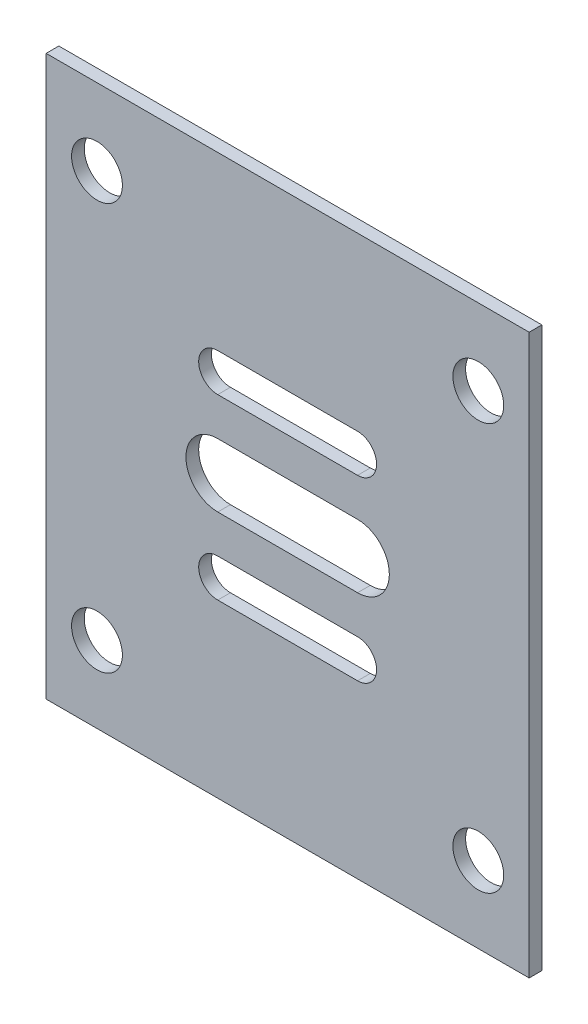
ISO-10303-21;
HEADER;
FILE_DESCRIPTION(('STEP AP214'),'2;1');
FILE_NAME('part.step','',(''),(''),'','','');
FILE_SCHEMA(('AUTOMOTIVE_DESIGN { 1 0 10303 214 1 1 1 1 }'));
ENDSEC;
DATA;
#1=APPLICATION_CONTEXT('core data for automotive mechanical design processes');
#2=APPLICATION_PROTOCOL_DEFINITION('international standard','automotive_design',2000,#1);
#3=PRODUCT_CONTEXT('',#1,'mechanical');
#4=PRODUCT('Part','Part','',(#3));
#5=PRODUCT_RELATED_PRODUCT_CATEGORY('part','',(#4));
#6=PRODUCT_DEFINITION_FORMATION('','',#4);
#7=PRODUCT_DEFINITION_CONTEXT('part definition',#1,'design');
#8=PRODUCT_DEFINITION('design','',#6,#7);
#9=PRODUCT_DEFINITION_SHAPE('','',#8);
#10=(LENGTH_UNIT() NAMED_UNIT(*) SI_UNIT(.MILLI.,.METRE.));
#11=(NAMED_UNIT(*) PLANE_ANGLE_UNIT() SI_UNIT($,.RADIAN.));
#12=(NAMED_UNIT(*) SI_UNIT($,.STERADIAN.) SOLID_ANGLE_UNIT());
#13=UNCERTAINTY_MEASURE_WITH_UNIT(LENGTH_MEASURE(1.E-05),#10,'distance_accuracy_value','');
#14=(GEOMETRIC_REPRESENTATION_CONTEXT(3) GLOBAL_UNCERTAINTY_ASSIGNED_CONTEXT((#13)) GLOBAL_UNIT_ASSIGNED_CONTEXT((#10,
#11,#12)) REPRESENTATION_CONTEXT('',''));
#15=CARTESIAN_POINT('',(0.,0.,0.));
#16=DIRECTION('',(0.,0.,1.));
#17=DIRECTION('',(1.,0.,0.));
#18=AXIS2_PLACEMENT_3D('',#15,#16,#17);
#19=CARTESIAN_POINT('',(0.,0.,1.));
#20=DIRECTION('',(0.,0.,-1.));
#21=DIRECTION('',(-1.,0.,0.));
#22=AXIS2_PLACEMENT_3D('',#19,#20,#21);
#23=PLANE('',#22);
#24=CARTESIAN_POINT('',(13.5,29.,1.));
#25=DIRECTION('',(0.,0.,1.));
#26=DIRECTION('',(1.,0.,0.));
#27=AXIS2_PLACEMENT_3D('',#24,#25,#26);
#28=CIRCLE('',#27,1.5);
#29=CARTESIAN_POINT('',(13.5,30.5,1.));
#30=VERTEX_POINT('',#29);
#31=CARTESIAN_POINT('',(13.5,27.5,1.));
#32=VERTEX_POINT('',#31);
#33=EDGE_CURVE('E201',#30,#32,#28,.T.);
#34=ORIENTED_EDGE('',*,*,#33,.F.);
#35=DIRECTION('',(-1.,0.,0.));
#36=VECTOR('',#35,1.);
#37=CARTESIAN_POINT('',(13.5,30.5,1.));
#38=LINE('',#37,#36);
#39=CARTESIAN_POINT('',(24.5,30.5,1.));
#40=VERTEX_POINT('',#39);
#41=EDGE_CURVE('E212',#40,#30,#38,.T.);
#42=ORIENTED_EDGE('',*,*,#41,.F.);
#43=CARTESIAN_POINT('',(24.5,29.,1.));
#44=DIRECTION('',(0.,0.,1.));
#45=DIRECTION('',(1.,0.,0.));
#46=AXIS2_PLACEMENT_3D('',#43,#44,#45);
#47=CIRCLE('',#46,1.5);
#48=CARTESIAN_POINT('',(24.5,27.5,1.));
#49=VERTEX_POINT('',#48);
#50=EDGE_CURVE('E208',#49,#40,#47,.T.);
#51=ORIENTED_EDGE('',*,*,#50,.F.);
#52=DIRECTION('',(1.,0.,0.));
#53=VECTOR('',#52,1.);
#54=CARTESIAN_POINT('',(13.5,27.5,1.));
#55=LINE('',#54,#53);
#56=EDGE_CURVE('E204',#32,#49,#55,.T.);
#57=ORIENTED_EDGE('',*,*,#56,.F.);
#58=EDGE_LOOP('',(#34,#42,#51,#57));
#59=FACE_BOUND('',#58,.T.);
#60=CARTESIAN_POINT('',(4.,6.,1.));
#61=DIRECTION('',(0.,0.,1.));
#62=DIRECTION('',(1.,0.,0.));
#63=AXIS2_PLACEMENT_3D('',#60,#61,#62);
#64=CIRCLE('',#63,2.);
#65=CARTESIAN_POINT('',(6.,6.,1.));
#66=VERTEX_POINT('',#65);
#67=EDGE_CURVE('E287',#66,#66,#64,.T.);
#68=ORIENTED_EDGE('',*,*,#67,.F.);
#69=EDGE_LOOP('',(#68));
#70=FACE_BOUND('',#69,.T.);
#71=CARTESIAN_POINT('',(34.,6.,1.));
#72=DIRECTION('',(0.,0.,1.));
#73=DIRECTION('',(1.,0.,0.));
#74=AXIS2_PLACEMENT_3D('',#71,#72,#73);
#75=CIRCLE('',#74,2.);
#76=CARTESIAN_POINT('',(36.,6.,1.));
#77=VERTEX_POINT('',#76);
#78=EDGE_CURVE('E295',#77,#77,#75,.T.);
#79=ORIENTED_EDGE('',*,*,#78,.F.);
#80=EDGE_LOOP('',(#79));
#81=FACE_BOUND('',#80,.T.);
#82=CARTESIAN_POINT('',(34.,38.,1.));
#83=DIRECTION('',(0.,0.,1.));
#84=DIRECTION('',(1.,0.,0.));
#85=AXIS2_PLACEMENT_3D('',#82,#83,#84);
#86=CIRCLE('',#85,2.);
#87=CARTESIAN_POINT('',(36.,38.,1.));
#88=VERTEX_POINT('',#87);
#89=EDGE_CURVE('E303',#88,#88,#86,.T.);
#90=ORIENTED_EDGE('',*,*,#89,.F.);
#91=EDGE_LOOP('',(#90));
#92=FACE_BOUND('',#91,.T.);
#93=CARTESIAN_POINT('',(4.,38.,1.));
#94=DIRECTION('',(0.,0.,1.));
#95=DIRECTION('',(1.,0.,0.));
#96=AXIS2_PLACEMENT_3D('',#93,#94,#95);
#97=CIRCLE('',#96,2.);
#98=CARTESIAN_POINT('',(6.,38.,1.));
#99=VERTEX_POINT('',#98);
#100=EDGE_CURVE('E311',#99,#99,#97,.T.);
#101=ORIENTED_EDGE('',*,*,#100,.F.);
#102=EDGE_LOOP('',(#101));
#103=FACE_BOUND('',#102,.T.);
#104=DIRECTION('',(0.,-1.,0.));
#105=VECTOR('',#104,1.);
#106=CARTESIAN_POINT('',(0.,0.,1.));
#107=LINE('',#106,#105);
#108=CARTESIAN_POINT('',(0.,44.,1.));
#109=VERTEX_POINT('',#108);
#110=CARTESIAN_POINT('',(0.,0.,1.));
#111=VERTEX_POINT('',#110);
#112=EDGE_CURVE('E319',#109,#111,#107,.T.);
#113=ORIENTED_EDGE('',*,*,#112,.T.);
#114=DIRECTION('',(1.,0.,0.));
#115=VECTOR('',#114,1.);
#116=CARTESIAN_POINT('',(0.,0.,1.));
#117=LINE('',#116,#115);
#118=CARTESIAN_POINT('',(38.,0.,1.));
#119=VERTEX_POINT('',#118);
#120=EDGE_CURVE('E323',#111,#119,#117,.T.);
#121=ORIENTED_EDGE('',*,*,#120,.T.);
#122=DIRECTION('',(0.,1.,0.));
#123=VECTOR('',#122,1.);
#124=CARTESIAN_POINT('',(38.,0.,1.));
#125=LINE('',#124,#123);
#126=CARTESIAN_POINT('',(38.,44.,1.));
#127=VERTEX_POINT('',#126);
#128=EDGE_CURVE('E327',#119,#127,#125,.T.);
#129=ORIENTED_EDGE('',*,*,#128,.T.);
#130=DIRECTION('',(-1.,0.,0.));
#131=VECTOR('',#130,1.);
#132=CARTESIAN_POINT('',(0.,44.,1.));
#133=LINE('',#132,#131);
#134=EDGE_CURVE('E330',#127,#109,#133,.T.);
#135=ORIENTED_EDGE('',*,*,#134,.T.);
#136=EDGE_LOOP('',(#113,#121,#129,#135));
#137=FACE_BOUND('',#136,.T.);
#138=CARTESIAN_POINT('',(13.5,22.,1.));
#139=DIRECTION('',(0.,0.,1.));
#140=DIRECTION('',(1.,0.,0.));
#141=AXIS2_PLACEMENT_3D('',#138,#139,#140);
#142=CIRCLE('',#141,2.5);
#143=CARTESIAN_POINT('',(13.5,24.5,1.));
#144=VERTEX_POINT('',#143);
#145=CARTESIAN_POINT('',(13.5,19.5,1.));
#146=VERTEX_POINT('',#145);
#147=EDGE_CURVE('E244',#144,#146,#142,.T.);
#148=ORIENTED_EDGE('',*,*,#147,.F.);
#149=DIRECTION('',(-1.,0.,0.));
#150=VECTOR('',#149,1.);
#151=CARTESIAN_POINT('',(13.5,24.5,1.));
#152=LINE('',#151,#150);
#153=CARTESIAN_POINT('',(24.5,24.5,1.));
#154=VERTEX_POINT('',#153);
#155=EDGE_CURVE('E255',#154,#144,#152,.T.);
#156=ORIENTED_EDGE('',*,*,#155,.F.);
#157=CARTESIAN_POINT('',(24.5,22.,1.));
#158=DIRECTION('',(0.,0.,1.));
#159=DIRECTION('',(1.,0.,0.));
#160=AXIS2_PLACEMENT_3D('',#157,#158,#159);
#161=CIRCLE('',#160,2.5);
#162=CARTESIAN_POINT('',(24.5,19.5,1.));
#163=VERTEX_POINT('',#162);
#164=EDGE_CURVE('E251',#163,#154,#161,.T.);
#165=ORIENTED_EDGE('',*,*,#164,.F.);
#166=DIRECTION('',(1.,0.,0.));
#167=VECTOR('',#166,1.);
#168=CARTESIAN_POINT('',(13.5,19.5,1.));
#169=LINE('',#168,#167);
#170=EDGE_CURVE('E247',#146,#163,#169,.T.);
#171=ORIENTED_EDGE('',*,*,#170,.F.);
#172=EDGE_LOOP('',(#148,#156,#165,#171));
#173=FACE_BOUND('',#172,.T.);
#174=CARTESIAN_POINT('',(13.5,15.,1.));
#175=DIRECTION('',(0.,0.,1.));
#176=DIRECTION('',(1.,0.,0.));
#177=AXIS2_PLACEMENT_3D('',#174,#175,#176);
#178=CIRCLE('',#177,1.5);
#179=CARTESIAN_POINT('',(13.5,16.5,1.));
#180=VERTEX_POINT('',#179);
#181=CARTESIAN_POINT('',(13.5,13.5,1.));
#182=VERTEX_POINT('',#181);
#183=EDGE_CURVE('E153',#180,#182,#178,.T.);
#184=ORIENTED_EDGE('',*,*,#183,.F.);
#185=DIRECTION('',(-1.,0.,0.));
#186=VECTOR('',#185,1.);
#187=CARTESIAN_POINT('',(13.5,16.5,1.));
#188=LINE('',#187,#186);
#189=CARTESIAN_POINT('',(24.5,16.5,1.));
#190=VERTEX_POINT('',#189);
#191=EDGE_CURVE('E179',#190,#180,#188,.T.);
#192=ORIENTED_EDGE('',*,*,#191,.F.);
#193=CARTESIAN_POINT('',(24.5,15.,1.));
#194=DIRECTION('',(0.,0.,1.));
#195=DIRECTION('',(1.,0.,0.));
#196=AXIS2_PLACEMENT_3D('',#193,#194,#195);
#197=CIRCLE('',#196,1.5);
#198=CARTESIAN_POINT('',(24.5,13.5,1.));
#199=VERTEX_POINT('',#198);
#200=EDGE_CURVE('E175',#199,#190,#197,.T.);
#201=ORIENTED_EDGE('',*,*,#200,.F.);
#202=DIRECTION('',(1.,0.,0.));
#203=VECTOR('',#202,1.);
#204=CARTESIAN_POINT('',(13.5,13.5,1.));
#205=LINE('',#204,#203);
#206=EDGE_CURVE('E162',#182,#199,#205,.T.);
#207=ORIENTED_EDGE('',*,*,#206,.F.);
#208=EDGE_LOOP('',(#184,#192,#201,#207));
#209=FACE_BOUND('',#208,.T.);
#210=ADVANCED_FACE('F39',(#59,#70,#81,#92,#103,#137,#173,#209),#23,.F.);
#211=CARTESIAN_POINT('',(0.,0.,0.));
#212=DIRECTION('',(0.,0.,-1.));
#213=DIRECTION('',(-1.,0.,0.));
#214=AXIS2_PLACEMENT_3D('',#211,#212,#213);
#215=PLANE('',#214);
#216=CARTESIAN_POINT('',(34.,6.,0.));
#217=DIRECTION('',(0.,0.,1.));
#218=DIRECTION('',(1.,0.,0.));
#219=AXIS2_PLACEMENT_3D('',#216,#217,#218);
#220=CIRCLE('',#219,2.);
#221=CARTESIAN_POINT('',(36.,6.,0.));
#222=VERTEX_POINT('',#221);
#223=EDGE_CURVE('E291',#222,#222,#220,.T.);
#224=ORIENTED_EDGE('',*,*,#223,.T.);
#225=EDGE_LOOP('',(#224));
#226=FACE_BOUND('',#225,.T.);
#227=CARTESIAN_POINT('',(4.,38.,0.));
#228=DIRECTION('',(0.,0.,1.));
#229=DIRECTION('',(1.,0.,0.));
#230=AXIS2_PLACEMENT_3D('',#227,#228,#229);
#231=CIRCLE('',#230,2.);
#232=CARTESIAN_POINT('',(6.,38.,0.));
#233=VERTEX_POINT('',#232);
#234=EDGE_CURVE('E307',#233,#233,#231,.T.);
#235=ORIENTED_EDGE('',*,*,#234,.T.);
#236=EDGE_LOOP('',(#235));
#237=FACE_BOUND('',#236,.T.);
#238=DIRECTION('',(0.,-1.,0.));
#239=VECTOR('',#238,1.);
#240=CARTESIAN_POINT('',(0.,0.,0.));
#241=LINE('',#240,#239);
#242=CARTESIAN_POINT('',(0.,44.,0.));
#243=VERTEX_POINT('',#242);
#244=CARTESIAN_POINT('',(0.,0.,0.));
#245=VERTEX_POINT('',#244);
#246=EDGE_CURVE('E315',#243,#245,#241,.T.);
#247=ORIENTED_EDGE('',*,*,#246,.F.);
#248=DIRECTION('',(-1.,0.,0.));
#249=VECTOR('',#248,1.);
#250=CARTESIAN_POINT('',(0.,44.,0.));
#251=LINE('',#250,#249);
#252=CARTESIAN_POINT('',(38.,44.,0.));
#253=VERTEX_POINT('',#252);
#254=EDGE_CURVE('E324',#253,#243,#251,.T.);
#255=ORIENTED_EDGE('',*,*,#254,.F.);
#256=DIRECTION('',(0.,1.,0.));
#257=VECTOR('',#256,1.);
#258=CARTESIAN_POINT('',(38.,0.,0.));
#259=LINE('',#258,#257);
#260=CARTESIAN_POINT('',(38.,0.,0.));
#261=VERTEX_POINT('',#260);
#262=EDGE_CURVE('E340',#261,#253,#259,.T.);
#263=ORIENTED_EDGE('',*,*,#262,.F.);
#264=DIRECTION('',(1.,0.,0.));
#265=VECTOR('',#264,1.);
#266=CARTESIAN_POINT('',(0.,0.,0.));
#267=LINE('',#266,#265);
#268=EDGE_CURVE('E337',#245,#261,#267,.T.);
#269=ORIENTED_EDGE('',*,*,#268,.F.);
#270=EDGE_LOOP('',(#247,#255,#263,#269));
#271=FACE_BOUND('',#270,.T.);
#272=CARTESIAN_POINT('',(34.,38.,0.));
#273=DIRECTION('',(0.,0.,1.));
#274=DIRECTION('',(1.,0.,0.));
#275=AXIS2_PLACEMENT_3D('',#272,#273,#274);
#276=CIRCLE('',#275,2.);
#277=CARTESIAN_POINT('',(36.,38.,0.));
#278=VERTEX_POINT('',#277);
#279=EDGE_CURVE('E299',#278,#278,#276,.T.);
#280=ORIENTED_EDGE('',*,*,#279,.T.);
#281=EDGE_LOOP('',(#280));
#282=FACE_BOUND('',#281,.T.);
#283=CARTESIAN_POINT('',(4.,6.,0.));
#284=DIRECTION('',(0.,0.,1.));
#285=DIRECTION('',(1.,0.,0.));
#286=AXIS2_PLACEMENT_3D('',#283,#284,#285);
#287=CIRCLE('',#286,2.);
#288=CARTESIAN_POINT('',(6.,6.,0.));
#289=VERTEX_POINT('',#288);
#290=EDGE_CURVE('E286',#289,#289,#287,.T.);
#291=ORIENTED_EDGE('',*,*,#290,.T.);
#292=EDGE_LOOP('',(#291));
#293=FACE_BOUND('',#292,.T.);
#294=DIRECTION('',(-1.,0.,0.));
#295=VECTOR('',#294,1.);
#296=CARTESIAN_POINT('',(13.5,24.5,0.));
#297=LINE('',#296,#295);
#298=CARTESIAN_POINT('',(24.5,24.5,0.));
#299=VERTEX_POINT('',#298);
#300=CARTESIAN_POINT('',(13.5,24.5,0.));
#301=VERTEX_POINT('',#300);
#302=EDGE_CURVE('E248',#299,#301,#297,.T.);
#303=ORIENTED_EDGE('',*,*,#302,.T.);
#304=CARTESIAN_POINT('',(13.5,22.,0.));
#305=DIRECTION('',(0.,0.,1.));
#306=DIRECTION('',(1.,0.,0.));
#307=AXIS2_PLACEMENT_3D('',#304,#305,#306);
#308=CIRCLE('',#307,2.5);
#309=CARTESIAN_POINT('',(13.5,19.5,0.));
#310=VERTEX_POINT('',#309);
#311=EDGE_CURVE('E243',#301,#310,#308,.T.);
#312=ORIENTED_EDGE('',*,*,#311,.T.);
#313=DIRECTION('',(1.,0.,0.));
#314=VECTOR('',#313,1.);
#315=CARTESIAN_POINT('',(13.5,19.5,0.));
#316=LINE('',#315,#314);
#317=CARTESIAN_POINT('',(24.5,19.5,0.));
#318=VERTEX_POINT('',#317);
#319=EDGE_CURVE('E262',#310,#318,#316,.T.);
#320=ORIENTED_EDGE('',*,*,#319,.T.);
#321=CARTESIAN_POINT('',(24.5,22.,0.));
#322=DIRECTION('',(0.,0.,1.));
#323=DIRECTION('',(1.,0.,0.));
#324=AXIS2_PLACEMENT_3D('',#321,#322,#323);
#325=CIRCLE('',#324,2.5);
#326=EDGE_CURVE('E266',#318,#299,#325,.T.);
#327=ORIENTED_EDGE('',*,*,#326,.T.);
#328=EDGE_LOOP('',(#303,#312,#320,#327));
#329=FACE_BOUND('',#328,.T.);
#330=DIRECTION('',(-1.,0.,0.));
#331=VECTOR('',#330,1.);
#332=CARTESIAN_POINT('',(13.5,30.5,0.));
#333=LINE('',#332,#331);
#334=CARTESIAN_POINT('',(24.5,30.5,0.));
#335=VERTEX_POINT('',#334);
#336=CARTESIAN_POINT('',(13.5,30.5,0.));
#337=VERTEX_POINT('',#336);
#338=EDGE_CURVE('E205',#335,#337,#333,.T.);
#339=ORIENTED_EDGE('',*,*,#338,.T.);
#340=CARTESIAN_POINT('',(13.5,29.,0.));
#341=DIRECTION('',(0.,0.,1.));
#342=DIRECTION('',(1.,0.,0.));
#343=AXIS2_PLACEMENT_3D('',#340,#341,#342);
#344=CIRCLE('',#343,1.5);
#345=CARTESIAN_POINT('',(13.5,27.5,0.));
#346=VERTEX_POINT('',#345);
#347=EDGE_CURVE('E171',#337,#346,#344,.T.);
#348=ORIENTED_EDGE('',*,*,#347,.T.);
#349=DIRECTION('',(1.,0.,0.));
#350=VECTOR('',#349,1.);
#351=CARTESIAN_POINT('',(13.5,27.5,0.));
#352=LINE('',#351,#350);
#353=CARTESIAN_POINT('',(24.5,27.5,0.));
#354=VERTEX_POINT('',#353);
#355=EDGE_CURVE('E219',#346,#354,#352,.T.);
#356=ORIENTED_EDGE('',*,*,#355,.T.);
#357=CARTESIAN_POINT('',(24.5,29.,0.));
#358=DIRECTION('',(0.,0.,1.));
#359=DIRECTION('',(1.,0.,0.));
#360=AXIS2_PLACEMENT_3D('',#357,#358,#359);
#361=CIRCLE('',#360,1.5);
#362=EDGE_CURVE('E223',#354,#335,#361,.T.);
#363=ORIENTED_EDGE('',*,*,#362,.T.);
#364=EDGE_LOOP('',(#339,#348,#356,#363));
#365=FACE_BOUND('',#364,.T.);
#366=DIRECTION('',(-1.,0.,0.));
#367=VECTOR('',#366,1.);
#368=CARTESIAN_POINT('',(13.5,16.5,0.));
#369=LINE('',#368,#367);
#370=CARTESIAN_POINT('',(24.5,16.5,0.));
#371=VERTEX_POINT('',#370);
#372=CARTESIAN_POINT('',(13.5,16.5,0.));
#373=VERTEX_POINT('',#372);
#374=EDGE_CURVE('E163',#371,#373,#369,.T.);
#375=ORIENTED_EDGE('',*,*,#374,.T.);
#376=CARTESIAN_POINT('',(13.5,15.,0.));
#377=DIRECTION('',(0.,0.,1.));
#378=DIRECTION('',(1.,0.,0.));
#379=AXIS2_PLACEMENT_3D('',#376,#377,#378);
#380=CIRCLE('',#379,1.5);
#381=CARTESIAN_POINT('',(13.5,13.5,0.));
#382=VERTEX_POINT('',#381);
#383=EDGE_CURVE('E63',#373,#382,#380,.T.);
#384=ORIENTED_EDGE('',*,*,#383,.T.);
#385=DIRECTION('',(1.,0.,0.));
#386=VECTOR('',#385,1.);
#387=CARTESIAN_POINT('',(13.5,13.5,0.));
#388=LINE('',#387,#386);
#389=CARTESIAN_POINT('',(24.5,13.5,0.));
#390=VERTEX_POINT('',#389);
#391=EDGE_CURVE('E169',#382,#390,#388,.T.);
#392=ORIENTED_EDGE('',*,*,#391,.T.);
#393=CARTESIAN_POINT('',(24.5,15.,0.));
#394=DIRECTION('',(0.,0.,1.));
#395=DIRECTION('',(1.,0.,0.));
#396=AXIS2_PLACEMENT_3D('',#393,#394,#395);
#397=CIRCLE('',#396,1.5);
#398=EDGE_CURVE('E188',#390,#371,#397,.T.);
#399=ORIENTED_EDGE('',*,*,#398,.T.);
#400=EDGE_LOOP('',(#375,#384,#392,#399));
#401=FACE_BOUND('',#400,.T.);
#402=ADVANCED_FACE('F363',(#226,#237,#271,#282,#293,#329,#365,#401),#215,.T.);
#403=CARTESIAN_POINT('',(0.,0.,1.));
#404=DIRECTION('',(1.,0.,0.));
#405=DIRECTION('',(0.,0.,-1.));
#406=AXIS2_PLACEMENT_3D('',#403,#404,#405);
#407=PLANE('',#406);
#408=ORIENTED_EDGE('',*,*,#246,.T.);
#409=DIRECTION('',(0.,0.,-1.));
#410=VECTOR('',#409,1.);
#411=CARTESIAN_POINT('',(0.,0.,1.));
#412=LINE('',#411,#410);
#413=EDGE_CURVE('E11',#111,#245,#412,.T.);
#414=ORIENTED_EDGE('',*,*,#413,.F.);
#415=ORIENTED_EDGE('',*,*,#112,.F.);
#416=DIRECTION('',(0.,0.,-1.));
#417=VECTOR('',#416,1.);
#418=CARTESIAN_POINT('',(0.,44.,1.));
#419=LINE('',#418,#417);
#420=EDGE_CURVE('E333',#109,#243,#419,.T.);
#421=ORIENTED_EDGE('',*,*,#420,.T.);
#422=EDGE_LOOP('',(#408,#414,#415,#421));
#423=FACE_BOUND('',#422,.T.);
#424=ADVANCED_FACE('F41',(#423),#407,.F.);
#425=CARTESIAN_POINT('',(0.,0.,1.));
#426=DIRECTION('',(0.,1.,0.));
#427=DIRECTION('',(0.,0.,1.));
#428=AXIS2_PLACEMENT_3D('',#425,#426,#427);
#429=PLANE('',#428);
#430=ORIENTED_EDGE('',*,*,#268,.T.);
#431=DIRECTION('',(0.,0.,-1.));
#432=VECTOR('',#431,1.);
#433=CARTESIAN_POINT('',(38.,0.,1.));
#434=LINE('',#433,#432);
#435=EDGE_CURVE('E48',#119,#261,#434,.T.);
#436=ORIENTED_EDGE('',*,*,#435,.F.);
#437=ORIENTED_EDGE('',*,*,#120,.F.);
#438=ORIENTED_EDGE('',*,*,#413,.T.);
#439=EDGE_LOOP('',(#430,#436,#437,#438));
#440=FACE_BOUND('',#439,.T.);
#441=ADVANCED_FACE('F374',(#440),#429,.F.);
#442=CARTESIAN_POINT('',(38.,0.,1.));
#443=DIRECTION('',(-1.,0.,0.));
#444=DIRECTION('',(0.,0.,1.));
#445=AXIS2_PLACEMENT_3D('',#442,#443,#444);
#446=PLANE('',#445);
#447=ORIENTED_EDGE('',*,*,#262,.T.);
#448=DIRECTION('',(0.,0.,-1.));
#449=VECTOR('',#448,1.);
#450=CARTESIAN_POINT('',(38.,44.,1.));
#451=LINE('',#450,#449);
#452=EDGE_CURVE('E348',#127,#253,#451,.T.);
#453=ORIENTED_EDGE('',*,*,#452,.F.);
#454=ORIENTED_EDGE('',*,*,#128,.F.);
#455=ORIENTED_EDGE('',*,*,#435,.T.);
#456=EDGE_LOOP('',(#447,#453,#454,#455));
#457=FACE_BOUND('',#456,.T.);
#458=ADVANCED_FACE('F357',(#457),#446,.F.);
#459=CARTESIAN_POINT('',(0.,44.,1.));
#460=DIRECTION('',(0.,-1.,0.));
#461=DIRECTION('',(0.,0.,-1.));
#462=AXIS2_PLACEMENT_3D('',#459,#460,#461);
#463=PLANE('',#462);
#464=ORIENTED_EDGE('',*,*,#254,.T.);
#465=ORIENTED_EDGE('',*,*,#420,.F.);
#466=ORIENTED_EDGE('',*,*,#134,.F.);
#467=ORIENTED_EDGE('',*,*,#452,.T.);
#468=EDGE_LOOP('',(#464,#465,#466,#467));
#469=FACE_BOUND('',#468,.T.);
#470=ADVANCED_FACE('F367',(#469),#463,.F.);
#471=CARTESIAN_POINT('',(4.,38.,1.));
#472=DIRECTION('',(0.,0.,-1.));
#473=DIRECTION('',(-1.,0.,0.));
#474=AXIS2_PLACEMENT_3D('',#471,#472,#473);
#475=CYLINDRICAL_SURFACE('',#474,2.);
#476=ORIENTED_EDGE('',*,*,#100,.T.);
#477=EDGE_LOOP('',(#476));
#478=FACE_BOUND('',#477,.T.);
#479=ORIENTED_EDGE('',*,*,#234,.F.);
#480=EDGE_LOOP('',(#479));
#481=FACE_BOUND('',#480,.T.);
#482=ADVANCED_FACE('F392',(#478,#481),#475,.F.);
#483=CARTESIAN_POINT('',(34.,38.,1.));
#484=DIRECTION('',(0.,0.,-1.));
#485=DIRECTION('',(-1.,0.,0.));
#486=AXIS2_PLACEMENT_3D('',#483,#484,#485);
#487=CYLINDRICAL_SURFACE('',#486,2.);
#488=ORIENTED_EDGE('',*,*,#89,.T.);
#489=EDGE_LOOP('',(#488));
#490=FACE_BOUND('',#489,.T.);
#491=ORIENTED_EDGE('',*,*,#279,.F.);
#492=EDGE_LOOP('',(#491));
#493=FACE_BOUND('',#492,.T.);
#494=ADVANCED_FACE('F399',(#490,#493),#487,.F.);
#495=CARTESIAN_POINT('',(34.,6.,1.));
#496=DIRECTION('',(0.,0.,-1.));
#497=DIRECTION('',(-1.,0.,0.));
#498=AXIS2_PLACEMENT_3D('',#495,#496,#497);
#499=CYLINDRICAL_SURFACE('',#498,2.);
#500=ORIENTED_EDGE('',*,*,#78,.T.);
#501=EDGE_LOOP('',(#500));
#502=FACE_BOUND('',#501,.T.);
#503=ORIENTED_EDGE('',*,*,#223,.F.);
#504=EDGE_LOOP('',(#503));
#505=FACE_BOUND('',#504,.T.);
#506=ADVANCED_FACE('F404',(#502,#505),#499,.F.);
#507=CARTESIAN_POINT('',(4.,6.,1.));
#508=DIRECTION('',(0.,0.,-1.));
#509=DIRECTION('',(-1.,0.,0.));
#510=AXIS2_PLACEMENT_3D('',#507,#508,#509);
#511=CYLINDRICAL_SURFACE('',#510,2.);
#512=ORIENTED_EDGE('',*,*,#67,.T.);
#513=EDGE_LOOP('',(#512));
#514=FACE_BOUND('',#513,.T.);
#515=ORIENTED_EDGE('',*,*,#290,.F.);
#516=EDGE_LOOP('',(#515));
#517=FACE_BOUND('',#516,.T.);
#518=ADVANCED_FACE('F414',(#514,#517),#511,.F.);
#519=CARTESIAN_POINT('',(13.5,22.,1.));
#520=DIRECTION('',(0.,0.,-1.));
#521=DIRECTION('',(-1.,0.,0.));
#522=AXIS2_PLACEMENT_3D('',#519,#520,#521);
#523=CYLINDRICAL_SURFACE('',#522,2.5);
#524=ORIENTED_EDGE('',*,*,#311,.F.);
#525=DIRECTION('',(0.,0.,-1.));
#526=VECTOR('',#525,1.);
#527=CARTESIAN_POINT('',(13.5,24.5,1.));
#528=LINE('',#527,#526);
#529=EDGE_CURVE('E258',#144,#301,#528,.T.);
#530=ORIENTED_EDGE('',*,*,#529,.F.);
#531=ORIENTED_EDGE('',*,*,#147,.T.);
#532=DIRECTION('',(0.,0.,-1.));
#533=VECTOR('',#532,1.);
#534=CARTESIAN_POINT('',(13.5,19.5,1.));
#535=LINE('',#534,#533);
#536=EDGE_CURVE('E282',#146,#310,#535,.T.);
#537=ORIENTED_EDGE('',*,*,#536,.T.);
#538=EDGE_LOOP('',(#524,#530,#531,#537));
#539=FACE_BOUND('',#538,.T.);
#540=ADVANCED_FACE('F421',(#539),#523,.F.);
#541=CARTESIAN_POINT('',(13.5,19.5,1.));
#542=DIRECTION('',(0.,1.,0.));
#543=DIRECTION('',(0.,0.,1.));
#544=AXIS2_PLACEMENT_3D('',#541,#542,#543);
#545=PLANE('',#544);
#546=ORIENTED_EDGE('',*,*,#319,.F.);
#547=ORIENTED_EDGE('',*,*,#536,.F.);
#548=ORIENTED_EDGE('',*,*,#170,.T.);
#549=DIRECTION('',(0.,0.,-1.));
#550=VECTOR('',#549,1.);
#551=CARTESIAN_POINT('',(24.5,19.5,1.));
#552=LINE('',#551,#550);
#553=EDGE_CURVE('E279',#163,#318,#552,.T.);
#554=ORIENTED_EDGE('',*,*,#553,.T.);
#555=EDGE_LOOP('',(#546,#547,#548,#554));
#556=FACE_BOUND('',#555,.T.);
#557=ADVANCED_FACE('F425',(#556),#545,.T.);
#558=CARTESIAN_POINT('',(24.5,22.,1.));
#559=DIRECTION('',(0.,0.,-1.));
#560=DIRECTION('',(-1.,0.,0.));
#561=AXIS2_PLACEMENT_3D('',#558,#559,#560);
#562=CYLINDRICAL_SURFACE('',#561,2.5);
#563=ORIENTED_EDGE('',*,*,#326,.F.);
#564=ORIENTED_EDGE('',*,*,#553,.F.);
#565=ORIENTED_EDGE('',*,*,#164,.T.);
#566=DIRECTION('',(0.,0.,-1.));
#567=VECTOR('',#566,1.);
#568=CARTESIAN_POINT('',(24.5,24.5,1.));
#569=LINE('',#568,#567);
#570=EDGE_CURVE('E276',#154,#299,#569,.T.);
#571=ORIENTED_EDGE('',*,*,#570,.T.);
#572=EDGE_LOOP('',(#563,#564,#565,#571));
#573=FACE_BOUND('',#572,.T.);
#574=ADVANCED_FACE('F429',(#573),#562,.F.);
#575=CARTESIAN_POINT('',(13.5,24.5,1.));
#576=DIRECTION('',(0.,-1.,0.));
#577=DIRECTION('',(0.,0.,-1.));
#578=AXIS2_PLACEMENT_3D('',#575,#576,#577);
#579=PLANE('',#578);
#580=ORIENTED_EDGE('',*,*,#302,.F.);
#581=ORIENTED_EDGE('',*,*,#570,.F.);
#582=ORIENTED_EDGE('',*,*,#155,.T.);
#583=ORIENTED_EDGE('',*,*,#529,.T.);
#584=EDGE_LOOP('',(#580,#581,#582,#583));
#585=FACE_BOUND('',#584,.T.);
#586=ADVANCED_FACE('F433',(#585),#579,.T.);
#587=CARTESIAN_POINT('',(13.5,29.,1.));
#588=DIRECTION('',(0.,0.,-1.));
#589=DIRECTION('',(-1.,0.,0.));
#590=AXIS2_PLACEMENT_3D('',#587,#588,#589);
#591=CYLINDRICAL_SURFACE('',#590,1.5);
#592=ORIENTED_EDGE('',*,*,#347,.F.);
#593=DIRECTION('',(0.,0.,-1.));
#594=VECTOR('',#593,1.);
#595=CARTESIAN_POINT('',(13.5,30.5,1.));
#596=LINE('',#595,#594);
#597=EDGE_CURVE('E215',#30,#337,#596,.T.);
#598=ORIENTED_EDGE('',*,*,#597,.F.);
#599=ORIENTED_EDGE('',*,*,#33,.T.);
#600=DIRECTION('',(0.,0.,-1.));
#601=VECTOR('',#600,1.);
#602=CARTESIAN_POINT('',(13.5,27.5,1.));
#603=LINE('',#602,#601);
#604=EDGE_CURVE('E239',#32,#346,#603,.T.);
#605=ORIENTED_EDGE('',*,*,#604,.T.);
#606=EDGE_LOOP('',(#592,#598,#599,#605));
#607=FACE_BOUND('',#606,.T.);
#608=ADVANCED_FACE('F437',(#607),#591,.F.);
#609=CARTESIAN_POINT('',(13.5,27.5,1.));
#610=DIRECTION('',(0.,1.,0.));
#611=DIRECTION('',(0.,0.,1.));
#612=AXIS2_PLACEMENT_3D('',#609,#610,#611);
#613=PLANE('',#612);
#614=ORIENTED_EDGE('',*,*,#355,.F.);
#615=ORIENTED_EDGE('',*,*,#604,.F.);
#616=ORIENTED_EDGE('',*,*,#56,.T.);
#617=DIRECTION('',(0.,0.,-1.));
#618=VECTOR('',#617,1.);
#619=CARTESIAN_POINT('',(24.5,27.5,1.));
#620=LINE('',#619,#618);
#621=EDGE_CURVE('E236',#49,#354,#620,.T.);
#622=ORIENTED_EDGE('',*,*,#621,.T.);
#623=EDGE_LOOP('',(#614,#615,#616,#622));
#624=FACE_BOUND('',#623,.T.);
#625=ADVANCED_FACE('F441',(#624),#613,.T.);
#626=CARTESIAN_POINT('',(24.5,29.,1.));
#627=DIRECTION('',(0.,0.,-1.));
#628=DIRECTION('',(-1.,0.,0.));
#629=AXIS2_PLACEMENT_3D('',#626,#627,#628);
#630=CYLINDRICAL_SURFACE('',#629,1.5);
#631=ORIENTED_EDGE('',*,*,#362,.F.);
#632=ORIENTED_EDGE('',*,*,#621,.F.);
#633=ORIENTED_EDGE('',*,*,#50,.T.);
#634=DIRECTION('',(0.,0.,-1.));
#635=VECTOR('',#634,1.);
#636=CARTESIAN_POINT('',(24.5,30.5,1.));
#637=LINE('',#636,#635);
#638=EDGE_CURVE('E233',#40,#335,#637,.T.);
#639=ORIENTED_EDGE('',*,*,#638,.T.);
#640=EDGE_LOOP('',(#631,#632,#633,#639));
#641=FACE_BOUND('',#640,.T.);
#642=ADVANCED_FACE('F445',(#641),#630,.F.);
#643=CARTESIAN_POINT('',(13.5,30.5,1.));
#644=DIRECTION('',(0.,-1.,0.));
#645=DIRECTION('',(0.,0.,-1.));
#646=AXIS2_PLACEMENT_3D('',#643,#644,#645);
#647=PLANE('',#646);
#648=ORIENTED_EDGE('',*,*,#338,.F.);
#649=ORIENTED_EDGE('',*,*,#638,.F.);
#650=ORIENTED_EDGE('',*,*,#41,.T.);
#651=ORIENTED_EDGE('',*,*,#597,.T.);
#652=EDGE_LOOP('',(#648,#649,#650,#651));
#653=FACE_BOUND('',#652,.T.);
#654=ADVANCED_FACE('F449',(#653),#647,.T.);
#655=CARTESIAN_POINT('',(13.5,15.,1.));
#656=DIRECTION('',(0.,0.,-1.));
#657=DIRECTION('',(-1.,0.,0.));
#658=AXIS2_PLACEMENT_3D('',#655,#656,#657);
#659=CYLINDRICAL_SURFACE('',#658,1.5);
#660=ORIENTED_EDGE('',*,*,#383,.F.);
#661=DIRECTION('',(0.,0.,-1.));
#662=VECTOR('',#661,1.);
#663=CARTESIAN_POINT('',(13.5,16.5,1.));
#664=LINE('',#663,#662);
#665=EDGE_CURVE('E157',#180,#373,#664,.T.);
#666=ORIENTED_EDGE('',*,*,#665,.F.);
#667=ORIENTED_EDGE('',*,*,#183,.T.);
#668=DIRECTION('',(0.,0.,-1.));
#669=VECTOR('',#668,1.);
#670=CARTESIAN_POINT('',(13.5,13.5,1.));
#671=LINE('',#670,#669);
#672=EDGE_CURVE('E156',#182,#382,#671,.T.);
#673=ORIENTED_EDGE('',*,*,#672,.T.);
#674=EDGE_LOOP('',(#660,#666,#667,#673));
#675=FACE_BOUND('',#674,.T.);
#676=ADVANCED_FACE('F155',(#675),#659,.F.);
#677=CARTESIAN_POINT('',(13.5,13.5,1.));
#678=DIRECTION('',(0.,1.,0.));
#679=DIRECTION('',(0.,0.,1.));
#680=AXIS2_PLACEMENT_3D('',#677,#678,#679);
#681=PLANE('',#680);
#682=ORIENTED_EDGE('',*,*,#391,.F.);
#683=ORIENTED_EDGE('',*,*,#672,.F.);
#684=ORIENTED_EDGE('',*,*,#206,.T.);
#685=DIRECTION('',(0.,0.,-1.));
#686=VECTOR('',#685,1.);
#687=CARTESIAN_POINT('',(24.5,13.5,1.));
#688=LINE('',#687,#686);
#689=EDGE_CURVE('E172',#199,#390,#688,.T.);
#690=ORIENTED_EDGE('',*,*,#689,.T.);
#691=EDGE_LOOP('',(#682,#683,#684,#690));
#692=FACE_BOUND('',#691,.T.);
#693=ADVANCED_FACE('F166',(#692),#681,.T.);
#694=CARTESIAN_POINT('',(24.5,15.,1.));
#695=DIRECTION('',(0.,0.,-1.));
#696=DIRECTION('',(-1.,0.,0.));
#697=AXIS2_PLACEMENT_3D('',#694,#695,#696);
#698=CYLINDRICAL_SURFACE('',#697,1.5);
#699=ORIENTED_EDGE('',*,*,#398,.F.);
#700=ORIENTED_EDGE('',*,*,#689,.F.);
#701=ORIENTED_EDGE('',*,*,#200,.T.);
#702=DIRECTION('',(0.,0.,-1.));
#703=VECTOR('',#702,1.);
#704=CARTESIAN_POINT('',(24.5,16.5,1.));
#705=LINE('',#704,#703);
#706=EDGE_CURVE('E55',#190,#371,#705,.T.);
#707=ORIENTED_EDGE('',*,*,#706,.T.);
#708=EDGE_LOOP('',(#699,#700,#701,#707));
#709=FACE_BOUND('',#708,.T.);
#710=ADVANCED_FACE('F458',(#709),#698,.F.);
#711=CARTESIAN_POINT('',(13.5,16.5,1.));
#712=DIRECTION('',(0.,-1.,0.));
#713=DIRECTION('',(0.,0.,-1.));
#714=AXIS2_PLACEMENT_3D('',#711,#712,#713);
#715=PLANE('',#714);
#716=ORIENTED_EDGE('',*,*,#374,.F.);
#717=ORIENTED_EDGE('',*,*,#706,.F.);
#718=ORIENTED_EDGE('',*,*,#191,.T.);
#719=ORIENTED_EDGE('',*,*,#665,.T.);
#720=EDGE_LOOP('',(#716,#717,#718,#719));
#721=FACE_BOUND('',#720,.T.);
#722=ADVANCED_FACE('F461',(#721),#715,.T.);
#723=CLOSED_SHELL('',(#210,#402,#424,#441,#458,#470,#482,#494,#506,#518,#540,#557,#574,#586,
#608,#625,#642,#654,#676,#693,#710,#722));
#724=MANIFOLD_SOLID_BREP('B2',#723);
#725=ADVANCED_BREP_SHAPE_REPRESENTATION('',(#18,#724),#14);
#726=SHAPE_DEFINITION_REPRESENTATION(#9,#725);
ENDSEC;
END-ISO-10303-21;
